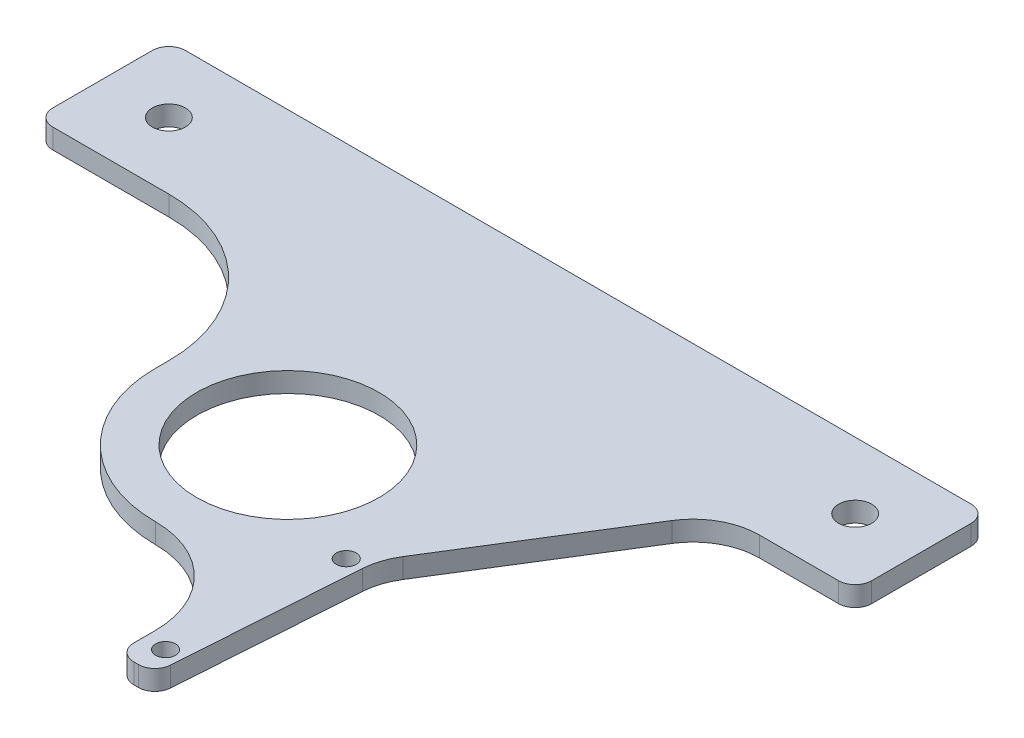
ISO-10303-21;
HEADER;
FILE_DESCRIPTION(('STEP AP214'),'2;1');
FILE_NAME('part.step','',(''),(''),'','','');
FILE_SCHEMA(('AUTOMOTIVE_DESIGN { 1 0 10303 214 1 1 1 1 }'));
ENDSEC;
DATA;
#1=APPLICATION_CONTEXT('core data for automotive mechanical design processes');
#2=APPLICATION_PROTOCOL_DEFINITION('international standard','automotive_design',2000,#1);
#3=PRODUCT_CONTEXT('',#1,'mechanical');
#4=PRODUCT('Part','Part','',(#3));
#5=PRODUCT_RELATED_PRODUCT_CATEGORY('part','',(#4));
#6=PRODUCT_DEFINITION_FORMATION('','',#4);
#7=PRODUCT_DEFINITION_CONTEXT('part definition',#1,'design');
#8=PRODUCT_DEFINITION('design','',#6,#7);
#9=PRODUCT_DEFINITION_SHAPE('','',#8);
#10=(LENGTH_UNIT() NAMED_UNIT(*) SI_UNIT(.MILLI.,.METRE.));
#11=(NAMED_UNIT(*) PLANE_ANGLE_UNIT() SI_UNIT($,.RADIAN.));
#12=(NAMED_UNIT(*) SI_UNIT($,.STERADIAN.) SOLID_ANGLE_UNIT());
#13=UNCERTAINTY_MEASURE_WITH_UNIT(LENGTH_MEASURE(1.E-05),#10,'distance_accuracy_value','');
#14=(GEOMETRIC_REPRESENTATION_CONTEXT(3) GLOBAL_UNCERTAINTY_ASSIGNED_CONTEXT((#13)) GLOBAL_UNIT_ASSIGNED_CONTEXT((#10,
#11,#12)) REPRESENTATION_CONTEXT('',''));
#15=CARTESIAN_POINT('',(0.,0.,0.));
#16=DIRECTION('',(0.,0.,1.));
#17=DIRECTION('',(1.,0.,0.));
#18=AXIS2_PLACEMENT_3D('',#15,#16,#17);
#19=CARTESIAN_POINT('',(-83.5,6.,-4.10000000000002));
#20=DIRECTION('',(0.,1.,0.));
#21=DIRECTION('',(0.,0.,1.));
#22=AXIS2_PLACEMENT_3D('',#19,#20,#21);
#23=PLANE('',#22);
#24=CARTESIAN_POINT('',(-103.5,6.,-67.5999999999998));
#25=DIRECTION('',(0.,1.,0.));
#26=DIRECTION('',(0.,0.,1.));
#27=AXIS2_PLACEMENT_3D('',#24,#25,#26);
#28=CIRCLE('',#27,5.00000000000001);
#29=CARTESIAN_POINT('',(-103.5,6.,-62.5999999999998));
#30=VERTEX_POINT('',#29);
#31=EDGE_CURVE('E437',#30,#30,#28,.T.);
#32=ORIENTED_EDGE('',*,*,#31,.F.);
#33=EDGE_LOOP('',(#32));
#34=FACE_BOUND('',#33,.T.);
#35=CARTESIAN_POINT('',(38.5,6.,20.9));
#36=DIRECTION('',(0.,1.,0.));
#37=DIRECTION('',(0.,0.,1.));
#38=AXIS2_PLACEMENT_3D('',#35,#36,#37);
#39=CIRCLE('',#38,3.);
#40=CARTESIAN_POINT('',(38.5,6.,23.9));
#41=VERTEX_POINT('',#40);
#42=EDGE_CURVE('E421',#41,#41,#39,.T.);
#43=ORIENTED_EDGE('',*,*,#42,.F.);
#44=EDGE_LOOP('',(#43));
#45=FACE_BOUND('',#44,.T.);
#46=DIRECTION('',(1.,0.,0.));
#47=VECTOR('',#46,1.);
#48=CARTESIAN_POINT('',(123.5,6.,-47.6));
#49=LINE('',#48,#47);
#50=CARTESIAN_POINT('',(94.6041078008775,6.,-47.6));
#51=VERTEX_POINT('',#50);
#52=CARTESIAN_POINT('',(118.5,6.,-47.6));
#53=VERTEX_POINT('',#52);
#54=EDGE_CURVE('E251',#51,#53,#49,.T.);
#55=ORIENTED_EDGE('',*,*,#54,.T.);
#56=CARTESIAN_POINT('',(118.5,6.,-52.6));
#57=DIRECTION('',(0.,1.,0.));
#58=DIRECTION('',(0.,0.,1.));
#59=AXIS2_PLACEMENT_3D('',#56,#57,#58);
#60=CIRCLE('',#59,5.);
#61=CARTESIAN_POINT('',(123.5,6.,-52.6));
#62=VERTEX_POINT('',#61);
#63=EDGE_CURVE('E388',#53,#62,#60,.T.);
#64=ORIENTED_EDGE('',*,*,#63,.T.);
#65=DIRECTION('',(0.,0.,-1.));
#66=VECTOR('',#65,1.);
#67=CARTESIAN_POINT('',(123.5,6.,-87.5999999999998));
#68=LINE('',#67,#66);
#69=CARTESIAN_POINT('',(123.5,6.,-82.5999999999998));
#70=VERTEX_POINT('',#69);
#71=EDGE_CURVE('E254',#62,#70,#68,.T.);
#72=ORIENTED_EDGE('',*,*,#71,.T.);
#73=CARTESIAN_POINT('',(118.5,6.,-82.5999999999998));
#74=DIRECTION('',(0.,1.,0.));
#75=DIRECTION('',(0.,0.,1.));
#76=AXIS2_PLACEMENT_3D('',#73,#74,#75);
#77=CIRCLE('',#76,5.);
#78=CARTESIAN_POINT('',(118.5,6.,-87.5999999999998));
#79=VERTEX_POINT('',#78);
#80=EDGE_CURVE('E64',#70,#79,#77,.T.);
#81=ORIENTED_EDGE('',*,*,#80,.T.);
#82=DIRECTION('',(-1.,0.,0.));
#83=VECTOR('',#82,1.);
#84=CARTESIAN_POINT('',(-123.5,6.,-87.5999999999998));
#85=LINE('',#84,#83);
#86=CARTESIAN_POINT('',(-118.5,6.,-87.5999999999998));
#87=VERTEX_POINT('',#86);
#88=EDGE_CURVE('E257',#79,#87,#85,.T.);
#89=ORIENTED_EDGE('',*,*,#88,.T.);
#90=CARTESIAN_POINT('',(-118.5,6.,-82.5999999999998));
#91=DIRECTION('',(0.,1.,0.));
#92=DIRECTION('',(0.,0.,1.));
#93=AXIS2_PLACEMENT_3D('',#90,#91,#92);
#94=CIRCLE('',#93,5.);
#95=CARTESIAN_POINT('',(-123.5,6.,-82.5999999999998));
#96=VERTEX_POINT('',#95);
#97=EDGE_CURVE('E383',#87,#96,#94,.T.);
#98=ORIENTED_EDGE('',*,*,#97,.T.);
#99=DIRECTION('',(0.,0.,1.));
#100=VECTOR('',#99,1.);
#101=CARTESIAN_POINT('',(-123.5,6.,-87.5999999999998));
#102=LINE('',#101,#100);
#103=CARTESIAN_POINT('',(-123.5,6.,-52.5999999999998));
#104=VERTEX_POINT('',#103);
#105=EDGE_CURVE('E198',#96,#104,#102,.T.);
#106=ORIENTED_EDGE('',*,*,#105,.T.);
#107=CARTESIAN_POINT('',(-118.5,6.,-52.5999999999998));
#108=DIRECTION('',(0.,1.,0.));
#109=DIRECTION('',(0.,0.,1.));
#110=AXIS2_PLACEMENT_3D('',#107,#108,#109);
#111=CIRCLE('',#110,5.);
#112=CARTESIAN_POINT('',(-118.5,6.,-47.5999999999999));
#113=VERTEX_POINT('',#112);
#114=EDGE_CURVE('E194',#104,#113,#111,.T.);
#115=ORIENTED_EDGE('',*,*,#114,.T.);
#116=DIRECTION('',(1.,0.,0.));
#117=VECTOR('',#116,1.);
#118=CARTESIAN_POINT('',(-83.5,6.,-47.6));
#119=LINE('',#118,#117);
#120=CARTESIAN_POINT('',(-83.5,6.,-47.6));
#121=VERTEX_POINT('',#120);
#122=EDGE_CURVE('E185',#113,#121,#119,.T.);
#123=ORIENTED_EDGE('',*,*,#122,.T.);
#124=CARTESIAN_POINT('',(-83.5,6.,-4.10000000000002));
#125=DIRECTION('',(0.,-1.,0.));
#126=DIRECTION('',(0.,0.,1.));
#127=AXIS2_PLACEMENT_3D('',#124,#125,#126);
#128=CIRCLE('',#127,43.5);
#129=CARTESIAN_POINT('',(-40.,6.,-4.10000000000002));
#130=VERTEX_POINT('',#129);
#131=EDGE_CURVE('E190',#121,#130,#128,.T.);
#132=ORIENTED_EDGE('',*,*,#131,.T.);
#133=DIRECTION('',(0.,0.,1.));
#134=VECTOR('',#133,1.);
#135=CARTESIAN_POINT('',(-40.,6.,0.));
#136=LINE('',#135,#134);
#137=CARTESIAN_POINT('',(-40.,6.,0.));
#138=VERTEX_POINT('',#137);
#139=EDGE_CURVE('E215',#130,#138,#136,.T.);
#140=ORIENTED_EDGE('',*,*,#139,.T.);
#141=CARTESIAN_POINT('',(0.,6.,0.));
#142=DIRECTION('',(0.,1.,0.));
#143=DIRECTION('',(0.,0.,1.));
#144=AXIS2_PLACEMENT_3D('',#141,#142,#143);
#145=CIRCLE('',#144,40.);
#146=CARTESIAN_POINT('',(0.,6.,40.));
#147=VERTEX_POINT('',#146);
#148=EDGE_CURVE('E218',#138,#147,#145,.T.);
#149=ORIENTED_EDGE('',*,*,#148,.T.);
#150=CARTESIAN_POINT('',(0.,6.,68.4627408788224));
#151=DIRECTION('',(0.,-1.,0.));
#152=DIRECTION('',(0.,0.,-1.));
#153=AXIS2_PLACEMENT_3D('',#150,#151,#152);
#154=CIRCLE('',#153,28.4627408788224);
#155=CARTESIAN_POINT('',(28.4627408788224,6.,68.4627408788224));
#156=VERTEX_POINT('',#155);
#157=EDGE_CURVE('E224',#147,#156,#154,.T.);
#158=ORIENTED_EDGE('',*,*,#157,.T.);
#159=DIRECTION('',(0.,0.,1.));
#160=VECTOR('',#159,1.);
#161=CARTESIAN_POINT('',(28.4627408788224,6.,74.8999999999999));
#162=LINE('',#161,#160);
#163=CARTESIAN_POINT('',(28.4627408788224,6.,74.8999999999999));
#164=VERTEX_POINT('',#163);
#165=EDGE_CURVE('E227',#156,#164,#162,.T.);
#166=ORIENTED_EDGE('',*,*,#165,.T.);
#167=CARTESIAN_POINT('',(33.4627408788224,6.,74.8999999999999));
#168=DIRECTION('',(0.,1.,0.));
#169=DIRECTION('',(0.,0.,-1.));
#170=AXIS2_PLACEMENT_3D('',#167,#168,#169);
#171=CIRCLE('',#170,5.);
#172=CARTESIAN_POINT('',(33.4627408788224,6.,79.8999999999999));
#173=VERTEX_POINT('',#172);
#174=EDGE_CURVE('E230',#164,#173,#171,.T.);
#175=ORIENTED_EDGE('',*,*,#174,.T.);
#176=DIRECTION('',(1.,0.,0.));
#177=VECTOR('',#176,1.);
#178=CARTESIAN_POINT('',(34.7941176470588,6.,79.8999999999999));
#179=LINE('',#178,#177);
#180=CARTESIAN_POINT('',(34.7941176470588,6.,79.8999999999999));
#181=VERTEX_POINT('',#180);
#182=EDGE_CURVE('E233',#173,#181,#179,.T.);
#183=ORIENTED_EDGE('',*,*,#182,.T.);
#184=CARTESIAN_POINT('',(34.7941176470588,6.,74.8999999999999));
#185=DIRECTION('',(0.,1.,0.));
#186=DIRECTION('',(0.,0.,1.));
#187=AXIS2_PLACEMENT_3D('',#184,#185,#186);
#188=CIRCLE('',#187,5.);
#189=CARTESIAN_POINT('',(39.7823847572921,6.,75.2423320565846));
#190=VERTEX_POINT('',#189);
#191=EDGE_CURVE('E236',#181,#190,#188,.T.);
#192=ORIENTED_EDGE('',*,*,#191,.T.);
#193=DIRECTION('',(0.0684664113169268,0.,-0.997653422046645));
#194=VECTOR('',#193,1.);
#195=CARTESIAN_POINT('',(39.7823847572921,6.,75.2423320565846));
#196=LINE('',#195,#194);
#197=CARTESIAN_POINT('',(43.502792815924,6.,21.0306717736615));
#198=VERTEX_POINT('',#197);
#199=EDGE_CURVE('E239',#190,#198,#196,.T.);
#200=ORIENTED_EDGE('',*,*,#199,.T.);
#201=CARTESIAN_POINT('',(63.455861256857,6.,22.4));
#202=DIRECTION('',(0.,-1.,0.));
#203=DIRECTION('',(0.,0.,-1.));
#204=AXIS2_PLACEMENT_3D('',#201,#202,#203);
#205=CIRCLE('',#204,20.);
#206=CARTESIAN_POINT('',(46.4803869601442,6.,11.8248748280861));
#207=VERTEX_POINT('',#206);
#208=EDGE_CURVE('E242',#198,#207,#205,.T.);
#209=ORIENTED_EDGE('',*,*,#208,.T.);
#210=DIRECTION('',(0.528756258595692,0.,-0.848773714835636));
#211=VECTOR('',#210,1.);
#212=CARTESIAN_POINT('',(77.6286335041648,6.,-38.1751251719139));
#213=LINE('',#212,#211);
#214=CARTESIAN_POINT('',(77.6286335041648,6.,-38.1751251719139));
#215=VERTEX_POINT('',#214);
#216=EDGE_CURVE('E245',#207,#215,#213,.T.);
#217=ORIENTED_EDGE('',*,*,#216,.T.);
#218=CARTESIAN_POINT('',(94.6041078008775,6.,-27.6));
#219=DIRECTION('',(0.,-1.,0.));
#220=DIRECTION('',(0.,0.,1.));
#221=AXIS2_PLACEMENT_3D('',#218,#219,#220);
#222=CIRCLE('',#221,20.);
#223=EDGE_CURVE('E248',#215,#51,#222,.T.);
#224=ORIENTED_EDGE('',*,*,#223,.T.);
#225=EDGE_LOOP('',(#55,#64,#72,#81,#89,#98,#106,#115,#123,#132,#140,#149,#158,#166,#175,#183,
#192,#200,#209,#217,#224));
#226=FACE_BOUND('',#225,.T.);
#227=CARTESIAN_POINT('',(0.,6.,0.));
#228=DIRECTION('',(0.,1.,0.));
#229=DIRECTION('',(0.,0.,1.));
#230=AXIS2_PLACEMENT_3D('',#227,#228,#229);
#231=CIRCLE('',#230,27.5);
#232=CARTESIAN_POINT('',(0.,6.,27.5));
#233=VERTEX_POINT('',#232);
#234=EDGE_CURVE('E265',#233,#233,#231,.T.);
#235=ORIENTED_EDGE('',*,*,#234,.F.);
#236=EDGE_LOOP('',(#235));
#237=FACE_BOUND('',#236,.T.);
#238=CARTESIAN_POINT('',(35.,6.,71.9));
#239=DIRECTION('',(0.,1.,0.));
#240=DIRECTION('',(0.,0.,1.));
#241=AXIS2_PLACEMENT_3D('',#238,#239,#240);
#242=CIRCLE('',#241,3.);
#243=CARTESIAN_POINT('',(35.,6.,74.9));
#244=VERTEX_POINT('',#243);
#245=EDGE_CURVE('E429',#244,#244,#242,.T.);
#246=ORIENTED_EDGE('',*,*,#245,.F.);
#247=EDGE_LOOP('',(#246));
#248=FACE_BOUND('',#247,.T.);
#249=CARTESIAN_POINT('',(103.5,6.,-67.5999999999998));
#250=DIRECTION('',(0.,1.,0.));
#251=DIRECTION('',(0.,0.,-1.));
#252=AXIS2_PLACEMENT_3D('',#249,#250,#251);
#253=CIRCLE('',#252,5.00000000000001);
#254=CARTESIAN_POINT('',(103.5,6.,-72.5999999999998));
#255=VERTEX_POINT('',#254);
#256=EDGE_CURVE('E445',#255,#255,#253,.T.);
#257=ORIENTED_EDGE('',*,*,#256,.F.);
#258=EDGE_LOOP('',(#257));
#259=FACE_BOUND('',#258,.T.);
#260=ADVANCED_FACE('F41',(#34,#45,#226,#237,#248,#259),#23,.T.);
#261=CARTESIAN_POINT('',(-83.5,0.,-4.10000000000002));
#262=DIRECTION('',(0.,1.,0.));
#263=DIRECTION('',(0.,0.,1.));
#264=AXIS2_PLACEMENT_3D('',#261,#262,#263);
#265=PLANE('',#264);
#266=DIRECTION('',(0.,0.,-1.));
#267=VECTOR('',#266,1.);
#268=CARTESIAN_POINT('',(123.5,0.,-87.5999999999998));
#269=LINE('',#268,#267);
#270=CARTESIAN_POINT('',(123.5,0.,-52.6));
#271=VERTEX_POINT('',#270);
#272=CARTESIAN_POINT('',(123.5,0.,-82.5999999999998));
#273=VERTEX_POINT('',#272);
#274=EDGE_CURVE('E308',#271,#273,#269,.T.);
#275=ORIENTED_EDGE('',*,*,#274,.F.);
#276=CARTESIAN_POINT('',(118.5,0.,-52.6));
#277=DIRECTION('',(0.,1.,0.));
#278=DIRECTION('',(0.,0.,1.));
#279=AXIS2_PLACEMENT_3D('',#276,#277,#278);
#280=CIRCLE('',#279,5.);
#281=CARTESIAN_POINT('',(118.5,0.,-47.6));
#282=VERTEX_POINT('',#281);
#283=EDGE_CURVE('E375',#271,#282,#280,.F.);
#284=ORIENTED_EDGE('',*,*,#283,.T.);
#285=DIRECTION('',(1.,0.,0.));
#286=VECTOR('',#285,1.);
#287=CARTESIAN_POINT('',(123.5,0.,-47.6));
#288=LINE('',#287,#286);
#289=CARTESIAN_POINT('',(94.6041078008775,0.,-47.6));
#290=VERTEX_POINT('',#289);
#291=EDGE_CURVE('E304',#290,#282,#288,.T.);
#292=ORIENTED_EDGE('',*,*,#291,.F.);
#293=CARTESIAN_POINT('',(94.6041078008775,0.,-27.6));
#294=DIRECTION('',(0.,-1.,0.));
#295=DIRECTION('',(0.,0.,1.));
#296=AXIS2_PLACEMENT_3D('',#293,#294,#295);
#297=CIRCLE('',#296,20.);
#298=CARTESIAN_POINT('',(77.6286335041648,0.,-38.1751251719139));
#299=VERTEX_POINT('',#298);
#300=EDGE_CURVE('E301',#299,#290,#297,.T.);
#301=ORIENTED_EDGE('',*,*,#300,.F.);
#302=DIRECTION('',(0.528756258595692,0.,-0.848773714835636));
#303=VECTOR('',#302,1.);
#304=CARTESIAN_POINT('',(77.6286335041648,0.,-38.1751251719139));
#305=LINE('',#304,#303);
#306=CARTESIAN_POINT('',(46.4803869601442,0.,11.8248748280861));
#307=VERTEX_POINT('',#306);
#308=EDGE_CURVE('E298',#307,#299,#305,.T.);
#309=ORIENTED_EDGE('',*,*,#308,.F.);
#310=CARTESIAN_POINT('',(63.455861256857,0.,22.4));
#311=DIRECTION('',(0.,-1.,0.));
#312=DIRECTION('',(0.,0.,-1.));
#313=AXIS2_PLACEMENT_3D('',#310,#311,#312);
#314=CIRCLE('',#313,20.);
#315=CARTESIAN_POINT('',(43.502792815924,0.,21.0306717736615));
#316=VERTEX_POINT('',#315);
#317=EDGE_CURVE('E295',#316,#307,#314,.T.);
#318=ORIENTED_EDGE('',*,*,#317,.F.);
#319=DIRECTION('',(0.0684664113169268,0.,-0.997653422046645));
#320=VECTOR('',#319,1.);
#321=CARTESIAN_POINT('',(39.7823847572921,0.,75.2423320565846));
#322=LINE('',#321,#320);
#323=CARTESIAN_POINT('',(39.7823847572921,0.,75.2423320565846));
#324=VERTEX_POINT('',#323);
#325=EDGE_CURVE('E292',#324,#316,#322,.T.);
#326=ORIENTED_EDGE('',*,*,#325,.F.);
#327=CARTESIAN_POINT('',(34.7941176470588,0.,74.8999999999999));
#328=DIRECTION('',(0.,1.,0.));
#329=DIRECTION('',(0.,0.,1.));
#330=AXIS2_PLACEMENT_3D('',#327,#328,#329);
#331=CIRCLE('',#330,5.);
#332=CARTESIAN_POINT('',(34.7941176470588,0.,79.8999999999999));
#333=VERTEX_POINT('',#332);
#334=EDGE_CURVE('E289',#333,#324,#331,.T.);
#335=ORIENTED_EDGE('',*,*,#334,.F.);
#336=DIRECTION('',(1.,0.,0.));
#337=VECTOR('',#336,1.);
#338=CARTESIAN_POINT('',(34.7941176470588,0.,79.8999999999999));
#339=LINE('',#338,#337);
#340=CARTESIAN_POINT('',(33.4627408788224,0.,79.8999999999999));
#341=VERTEX_POINT('',#340);
#342=EDGE_CURVE('E286',#341,#333,#339,.T.);
#343=ORIENTED_EDGE('',*,*,#342,.F.);
#344=CARTESIAN_POINT('',(33.4627408788224,0.,74.8999999999999));
#345=DIRECTION('',(0.,1.,0.));
#346=DIRECTION('',(0.,0.,-1.));
#347=AXIS2_PLACEMENT_3D('',#344,#345,#346);
#348=CIRCLE('',#347,5.);
#349=CARTESIAN_POINT('',(28.4627408788224,0.,74.8999999999999));
#350=VERTEX_POINT('',#349);
#351=EDGE_CURVE('E283',#350,#341,#348,.T.);
#352=ORIENTED_EDGE('',*,*,#351,.F.);
#353=DIRECTION('',(0.,0.,1.));
#354=VECTOR('',#353,1.);
#355=CARTESIAN_POINT('',(28.4627408788224,0.,74.8999999999999));
#356=LINE('',#355,#354);
#357=CARTESIAN_POINT('',(28.4627408788224,0.,68.4627408788224));
#358=VERTEX_POINT('',#357);
#359=EDGE_CURVE('E280',#358,#350,#356,.T.);
#360=ORIENTED_EDGE('',*,*,#359,.F.);
#361=CARTESIAN_POINT('',(0.,0.,68.4627408788224));
#362=DIRECTION('',(0.,-1.,0.));
#363=DIRECTION('',(0.,0.,-1.));
#364=AXIS2_PLACEMENT_3D('',#361,#362,#363);
#365=CIRCLE('',#364,28.4627408788224);
#366=CARTESIAN_POINT('',(0.,0.,40.));
#367=VERTEX_POINT('',#366);
#368=EDGE_CURVE('E277',#367,#358,#365,.T.);
#369=ORIENTED_EDGE('',*,*,#368,.F.);
#370=CARTESIAN_POINT('',(0.,0.,0.));
#371=DIRECTION('',(0.,1.,0.));
#372=DIRECTION('',(0.,0.,1.));
#373=AXIS2_PLACEMENT_3D('',#370,#371,#372);
#374=CIRCLE('',#373,40.);
#375=CARTESIAN_POINT('',(-40.,0.,0.));
#376=VERTEX_POINT('',#375);
#377=EDGE_CURVE('E274',#376,#367,#374,.T.);
#378=ORIENTED_EDGE('',*,*,#377,.F.);
#379=DIRECTION('',(0.,0.,1.));
#380=VECTOR('',#379,1.);
#381=CARTESIAN_POINT('',(-40.,0.,0.));
#382=LINE('',#381,#380);
#383=CARTESIAN_POINT('',(-40.,0.,-4.10000000000002));
#384=VERTEX_POINT('',#383);
#385=EDGE_CURVE('E271',#384,#376,#382,.T.);
#386=ORIENTED_EDGE('',*,*,#385,.F.);
#387=CARTESIAN_POINT('',(-83.5,0.,-4.10000000000002));
#388=DIRECTION('',(0.,-1.,0.));
#389=DIRECTION('',(0.,0.,1.));
#390=AXIS2_PLACEMENT_3D('',#387,#388,#389);
#391=CIRCLE('',#390,43.5);
#392=CARTESIAN_POINT('',(-83.5,0.,-47.6));
#393=VERTEX_POINT('',#392);
#394=EDGE_CURVE('E268',#393,#384,#391,.T.);
#395=ORIENTED_EDGE('',*,*,#394,.F.);
#396=DIRECTION('',(1.,0.,0.));
#397=VECTOR('',#396,1.);
#398=CARTESIAN_POINT('',(-83.5,0.,-47.6));
#399=LINE('',#398,#397);
#400=CARTESIAN_POINT('',(-118.5,0.,-47.5999999999999));
#401=VERTEX_POINT('',#400);
#402=EDGE_CURVE('E204',#401,#393,#399,.T.);
#403=ORIENTED_EDGE('',*,*,#402,.F.);
#404=CARTESIAN_POINT('',(-118.5,0.,-52.5999999999998));
#405=DIRECTION('',(0.,1.,0.));
#406=DIRECTION('',(0.,0.,1.));
#407=AXIS2_PLACEMENT_3D('',#404,#405,#406);
#408=CIRCLE('',#407,5.);
#409=CARTESIAN_POINT('',(-123.5,0.,-52.5999999999998));
#410=VERTEX_POINT('',#409);
#411=EDGE_CURVE('E366',#401,#410,#408,.F.);
#412=ORIENTED_EDGE('',*,*,#411,.T.);
#413=DIRECTION('',(0.,0.,1.));
#414=VECTOR('',#413,1.);
#415=CARTESIAN_POINT('',(-123.5,0.,-87.5999999999998));
#416=LINE('',#415,#414);
#417=CARTESIAN_POINT('',(-123.5,0.,-82.5999999999998));
#418=VERTEX_POINT('',#417);
#419=EDGE_CURVE('E261',#418,#410,#416,.T.);
#420=ORIENTED_EDGE('',*,*,#419,.F.);
#421=CARTESIAN_POINT('',(-118.5,0.,-82.5999999999998));
#422=DIRECTION('',(0.,1.,0.));
#423=DIRECTION('',(0.,0.,1.));
#424=AXIS2_PLACEMENT_3D('',#421,#422,#423);
#425=CIRCLE('',#424,5.);
#426=CARTESIAN_POINT('',(-118.5,0.,-87.5999999999998));
#427=VERTEX_POINT('',#426);
#428=EDGE_CURVE('E369',#418,#427,#425,.F.);
#429=ORIENTED_EDGE('',*,*,#428,.T.);
#430=DIRECTION('',(-1.,0.,0.));
#431=VECTOR('',#430,1.);
#432=CARTESIAN_POINT('',(-123.5,0.,-87.5999999999998));
#433=LINE('',#432,#431);
#434=CARTESIAN_POINT('',(118.5,0.,-87.5999999999998));
#435=VERTEX_POINT('',#434);
#436=EDGE_CURVE('E312',#435,#427,#433,.T.);
#437=ORIENTED_EDGE('',*,*,#436,.F.);
#438=CARTESIAN_POINT('',(118.5,0.,-82.5999999999998));
#439=DIRECTION('',(0.,1.,0.));
#440=DIRECTION('',(0.,0.,1.));
#441=AXIS2_PLACEMENT_3D('',#438,#439,#440);
#442=CIRCLE('',#441,5.);
#443=EDGE_CURVE('E372',#435,#273,#442,.F.);
#444=ORIENTED_EDGE('',*,*,#443,.T.);
#445=EDGE_LOOP('',(#275,#284,#292,#301,#309,#318,#326,#335,#343,#352,#360,#369,#378,#386,#395,
#403,#412,#420,#429,#437,#444));
#446=FACE_BOUND('',#445,.T.);
#447=CARTESIAN_POINT('',(0.,0.,0.));
#448=DIRECTION('',(0.,1.,0.));
#449=DIRECTION('',(0.,0.,1.));
#450=AXIS2_PLACEMENT_3D('',#447,#448,#449);
#451=CIRCLE('',#450,27.5);
#452=CARTESIAN_POINT('',(0.,0.,27.5));
#453=VERTEX_POINT('',#452);
#454=EDGE_CURVE('E417',#453,#453,#451,.T.);
#455=ORIENTED_EDGE('',*,*,#454,.T.);
#456=EDGE_LOOP('',(#455));
#457=FACE_BOUND('',#456,.T.);
#458=CARTESIAN_POINT('',(38.5,0.,20.9));
#459=DIRECTION('',(0.,1.,0.));
#460=DIRECTION('',(0.,0.,1.));
#461=AXIS2_PLACEMENT_3D('',#458,#459,#460);
#462=CIRCLE('',#461,3.);
#463=CARTESIAN_POINT('',(38.5,0.,23.9));
#464=VERTEX_POINT('',#463);
#465=EDGE_CURVE('E425',#464,#464,#462,.T.);
#466=ORIENTED_EDGE('',*,*,#465,.T.);
#467=EDGE_LOOP('',(#466));
#468=FACE_BOUND('',#467,.T.);
#469=CARTESIAN_POINT('',(35.,0.,71.9));
#470=DIRECTION('',(0.,1.,0.));
#471=DIRECTION('',(0.,0.,1.));
#472=AXIS2_PLACEMENT_3D('',#469,#470,#471);
#473=CIRCLE('',#472,3.);
#474=CARTESIAN_POINT('',(35.,0.,74.9));
#475=VERTEX_POINT('',#474);
#476=EDGE_CURVE('E433',#475,#475,#473,.T.);
#477=ORIENTED_EDGE('',*,*,#476,.T.);
#478=EDGE_LOOP('',(#477));
#479=FACE_BOUND('',#478,.T.);
#480=CARTESIAN_POINT('',(-103.5,0.,-67.5999999999998));
#481=DIRECTION('',(0.,1.,0.));
#482=DIRECTION('',(0.,0.,1.));
#483=AXIS2_PLACEMENT_3D('',#480,#481,#482);
#484=CIRCLE('',#483,5.00000000000001);
#485=CARTESIAN_POINT('',(-103.5,0.,-62.5999999999998));
#486=VERTEX_POINT('',#485);
#487=EDGE_CURVE('E441',#486,#486,#484,.T.);
#488=ORIENTED_EDGE('',*,*,#487,.T.);
#489=EDGE_LOOP('',(#488));
#490=FACE_BOUND('',#489,.T.);
#491=CARTESIAN_POINT('',(103.5,0.,-67.5999999999998));
#492=DIRECTION('',(0.,1.,0.));
#493=DIRECTION('',(0.,0.,-1.));
#494=AXIS2_PLACEMENT_3D('',#491,#492,#493);
#495=CIRCLE('',#494,5.00000000000001);
#496=CARTESIAN_POINT('',(103.5,0.,-72.5999999999998));
#497=VERTEX_POINT('',#496);
#498=EDGE_CURVE('E449',#497,#497,#495,.T.);
#499=ORIENTED_EDGE('',*,*,#498,.T.);
#500=EDGE_LOOP('',(#499));
#501=FACE_BOUND('',#500,.T.);
#502=ADVANCED_FACE('F411',(#446,#457,#468,#479,#490,#501),#265,.F.);
#503=CARTESIAN_POINT('',(-123.5,6.,-87.5999999999998));
#504=DIRECTION('',(1.,0.,0.));
#505=DIRECTION('',(0.,0.,-1.));
#506=AXIS2_PLACEMENT_3D('',#503,#504,#505);
#507=PLANE('',#506);
#508=ORIENTED_EDGE('',*,*,#105,.F.);
#509=DIRECTION('',(0.,-1.,0.));
#510=VECTOR('',#509,1.);
#511=CARTESIAN_POINT('',(-123.5,6.,-82.5999999999998));
#512=LINE('',#511,#510);
#513=EDGE_CURVE('E50',#96,#418,#512,.T.);
#514=ORIENTED_EDGE('',*,*,#513,.T.);
#515=ORIENTED_EDGE('',*,*,#419,.T.);
#516=DIRECTION('',(0.,-1.,0.));
#517=VECTOR('',#516,1.);
#518=CARTESIAN_POINT('',(-123.5,6.,-52.5999999999998));
#519=LINE('',#518,#517);
#520=EDGE_CURVE('E397',#410,#104,#519,.F.);
#521=ORIENTED_EDGE('',*,*,#520,.T.);
#522=EDGE_LOOP('',(#508,#514,#515,#521));
#523=FACE_BOUND('',#522,.T.);
#524=ADVANCED_FACE('F405',(#523),#507,.F.);
#525=CARTESIAN_POINT('',(-83.5,6.,-47.6));
#526=DIRECTION('',(0.,0.,-1.));
#527=DIRECTION('',(-1.,0.,0.));
#528=AXIS2_PLACEMENT_3D('',#525,#526,#527);
#529=PLANE('',#528);
#530=ORIENTED_EDGE('',*,*,#122,.F.);
#531=DIRECTION('',(0.,-1.,0.));
#532=VECTOR('',#531,1.);
#533=CARTESIAN_POINT('',(-118.5,6.,-47.5999999999999));
#534=LINE('',#533,#532);
#535=EDGE_CURVE('E11',#113,#401,#534,.T.);
#536=ORIENTED_EDGE('',*,*,#535,.T.);
#537=ORIENTED_EDGE('',*,*,#402,.T.);
#538=DIRECTION('',(0.,-1.,0.));
#539=VECTOR('',#538,1.);
#540=CARTESIAN_POINT('',(-83.5,6.,-47.6));
#541=LINE('',#540,#539);
#542=EDGE_CURVE('E201',#121,#393,#541,.T.);
#543=ORIENTED_EDGE('',*,*,#542,.F.);
#544=EDGE_LOOP('',(#530,#536,#537,#543));
#545=FACE_BOUND('',#544,.T.);
#546=ADVANCED_FACE('F202',(#545),#529,.F.);
#547=CARTESIAN_POINT('',(-83.5,6.,-4.10000000000002));
#548=DIRECTION('',(0.,-1.,0.));
#549=DIRECTION('',(0.,0.,-1.));
#550=AXIS2_PLACEMENT_3D('',#547,#548,#549);
#551=CYLINDRICAL_SURFACE('',#550,43.5);
#552=ORIENTED_EDGE('',*,*,#394,.T.);
#553=DIRECTION('',(0.,-1.,0.));
#554=VECTOR('',#553,1.);
#555=CARTESIAN_POINT('',(-40.,6.,-4.10000000000002));
#556=LINE('',#555,#554);
#557=EDGE_CURVE('E209',#130,#384,#556,.T.);
#558=ORIENTED_EDGE('',*,*,#557,.F.);
#559=ORIENTED_EDGE('',*,*,#131,.F.);
#560=ORIENTED_EDGE('',*,*,#542,.T.);
#561=EDGE_LOOP('',(#552,#558,#559,#560));
#562=FACE_BOUND('',#561,.T.);
#563=ADVANCED_FACE('F211',(#562),#551,.F.);
#564=CARTESIAN_POINT('',(-40.,6.,0.));
#565=DIRECTION('',(1.,0.,0.));
#566=DIRECTION('',(0.,0.,-1.));
#567=AXIS2_PLACEMENT_3D('',#564,#565,#566);
#568=PLANE('',#567);
#569=ORIENTED_EDGE('',*,*,#385,.T.);
#570=DIRECTION('',(0.,-1.,0.));
#571=VECTOR('',#570,1.);
#572=CARTESIAN_POINT('',(-40.,6.,0.));
#573=LINE('',#572,#571);
#574=EDGE_CURVE('E354',#138,#376,#573,.T.);
#575=ORIENTED_EDGE('',*,*,#574,.F.);
#576=ORIENTED_EDGE('',*,*,#139,.F.);
#577=ORIENTED_EDGE('',*,*,#557,.T.);
#578=EDGE_LOOP('',(#569,#575,#576,#577));
#579=FACE_BOUND('',#578,.T.);
#580=ADVANCED_FACE('F523',(#579),#568,.F.);
#581=CARTESIAN_POINT('',(0.,6.,0.));
#582=DIRECTION('',(0.,-1.,0.));
#583=DIRECTION('',(0.,0.,-1.));
#584=AXIS2_PLACEMENT_3D('',#581,#582,#583);
#585=CYLINDRICAL_SURFACE('',#584,40.);
#586=ORIENTED_EDGE('',*,*,#377,.T.);
#587=DIRECTION('',(0.,-1.,0.));
#588=VECTOR('',#587,1.);
#589=CARTESIAN_POINT('',(0.,6.,40.));
#590=LINE('',#589,#588);
#591=EDGE_CURVE('E350',#147,#367,#590,.T.);
#592=ORIENTED_EDGE('',*,*,#591,.F.);
#593=ORIENTED_EDGE('',*,*,#148,.F.);
#594=ORIENTED_EDGE('',*,*,#574,.T.);
#595=EDGE_LOOP('',(#586,#592,#593,#594));
#596=FACE_BOUND('',#595,.T.);
#597=ADVANCED_FACE('F519',(#596),#585,.T.);
#598=CARTESIAN_POINT('',(0.,6.,68.4627408788224));
#599=DIRECTION('',(0.,-1.,0.));
#600=DIRECTION('',(0.,0.,-1.));
#601=AXIS2_PLACEMENT_3D('',#598,#599,#600);
#602=CYLINDRICAL_SURFACE('',#601,28.4627408788224);
#603=ORIENTED_EDGE('',*,*,#368,.T.);
#604=DIRECTION('',(0.,-1.,0.));
#605=VECTOR('',#604,1.);
#606=CARTESIAN_POINT('',(28.4627408788224,6.,68.4627408788224));
#607=LINE('',#606,#605);
#608=EDGE_CURVE('E346',#156,#358,#607,.T.);
#609=ORIENTED_EDGE('',*,*,#608,.F.);
#610=ORIENTED_EDGE('',*,*,#157,.F.);
#611=ORIENTED_EDGE('',*,*,#591,.T.);
#612=EDGE_LOOP('',(#603,#609,#610,#611));
#613=FACE_BOUND('',#612,.T.);
#614=ADVANCED_FACE('F515',(#613),#602,.F.);
#615=CARTESIAN_POINT('',(28.4627408788224,6.,74.8999999999999));
#616=DIRECTION('',(1.,0.,0.));
#617=DIRECTION('',(0.,0.,-1.));
#618=AXIS2_PLACEMENT_3D('',#615,#616,#617);
#619=PLANE('',#618);
#620=ORIENTED_EDGE('',*,*,#359,.T.);
#621=DIRECTION('',(0.,-1.,0.));
#622=VECTOR('',#621,1.);
#623=CARTESIAN_POINT('',(28.4627408788224,6.,74.8999999999999));
#624=LINE('',#623,#622);
#625=EDGE_CURVE('E342',#164,#350,#624,.T.);
#626=ORIENTED_EDGE('',*,*,#625,.F.);
#627=ORIENTED_EDGE('',*,*,#165,.F.);
#628=ORIENTED_EDGE('',*,*,#608,.T.);
#629=EDGE_LOOP('',(#620,#626,#627,#628));
#630=FACE_BOUND('',#629,.T.);
#631=ADVANCED_FACE('F511',(#630),#619,.F.);
#632=CARTESIAN_POINT('',(33.4627408788224,6.,74.8999999999999));
#633=DIRECTION('',(0.,-1.,0.));
#634=DIRECTION('',(0.,0.,-1.));
#635=AXIS2_PLACEMENT_3D('',#632,#633,#634);
#636=CYLINDRICAL_SURFACE('',#635,5.);
#637=ORIENTED_EDGE('',*,*,#351,.T.);
#638=DIRECTION('',(0.,-1.,0.));
#639=VECTOR('',#638,1.);
#640=CARTESIAN_POINT('',(33.4627408788224,6.,79.8999999999999));
#641=LINE('',#640,#639);
#642=EDGE_CURVE('E338',#173,#341,#641,.T.);
#643=ORIENTED_EDGE('',*,*,#642,.F.);
#644=ORIENTED_EDGE('',*,*,#174,.F.);
#645=ORIENTED_EDGE('',*,*,#625,.T.);
#646=EDGE_LOOP('',(#637,#643,#644,#645));
#647=FACE_BOUND('',#646,.T.);
#648=ADVANCED_FACE('F507',(#647),#636,.T.);
#649=CARTESIAN_POINT('',(34.7941176470588,6.,79.8999999999999));
#650=DIRECTION('',(0.,0.,-1.));
#651=DIRECTION('',(-1.,0.,0.));
#652=AXIS2_PLACEMENT_3D('',#649,#650,#651);
#653=PLANE('',#652);
#654=ORIENTED_EDGE('',*,*,#342,.T.);
#655=DIRECTION('',(0.,-1.,0.));
#656=VECTOR('',#655,1.);
#657=CARTESIAN_POINT('',(34.7941176470588,6.,79.8999999999999));
#658=LINE('',#657,#656);
#659=EDGE_CURVE('E334',#181,#333,#658,.T.);
#660=ORIENTED_EDGE('',*,*,#659,.F.);
#661=ORIENTED_EDGE('',*,*,#182,.F.);
#662=ORIENTED_EDGE('',*,*,#642,.T.);
#663=EDGE_LOOP('',(#654,#660,#661,#662));
#664=FACE_BOUND('',#663,.T.);
#665=ADVANCED_FACE('F503',(#664),#653,.F.);
#666=CARTESIAN_POINT('',(34.7941176470588,6.,74.8999999999999));
#667=DIRECTION('',(0.,-1.,0.));
#668=DIRECTION('',(0.,0.,-1.));
#669=AXIS2_PLACEMENT_3D('',#666,#667,#668);
#670=CYLINDRICAL_SURFACE('',#669,5.);
#671=ORIENTED_EDGE('',*,*,#334,.T.);
#672=DIRECTION('',(0.,-1.,0.));
#673=VECTOR('',#672,1.);
#674=CARTESIAN_POINT('',(39.7823847572921,6.,75.2423320565846));
#675=LINE('',#674,#673);
#676=EDGE_CURVE('E330',#190,#324,#675,.T.);
#677=ORIENTED_EDGE('',*,*,#676,.F.);
#678=ORIENTED_EDGE('',*,*,#191,.F.);
#679=ORIENTED_EDGE('',*,*,#659,.T.);
#680=EDGE_LOOP('',(#671,#677,#678,#679));
#681=FACE_BOUND('',#680,.T.);
#682=ADVANCED_FACE('F499',(#681),#670,.T.);
#683=CARTESIAN_POINT('',(39.7823847572921,6.,75.2423320565846));
#684=DIRECTION('',(-0.997653422046645,0.,-0.0684664113169268));
#685=DIRECTION('',(-0.0684664113169268,0.,0.997653422046645));
#686=AXIS2_PLACEMENT_3D('',#683,#684,#685);
#687=PLANE('',#686);
#688=ORIENTED_EDGE('',*,*,#325,.T.);
#689=DIRECTION('',(0.,-1.,0.));
#690=VECTOR('',#689,1.);
#691=CARTESIAN_POINT('',(43.502792815924,6.,21.0306717736615));
#692=LINE('',#691,#690);
#693=EDGE_CURVE('E326',#198,#316,#692,.T.);
#694=ORIENTED_EDGE('',*,*,#693,.F.);
#695=ORIENTED_EDGE('',*,*,#199,.F.);
#696=ORIENTED_EDGE('',*,*,#676,.T.);
#697=EDGE_LOOP('',(#688,#694,#695,#696));
#698=FACE_BOUND('',#697,.T.);
#699=ADVANCED_FACE('F495',(#698),#687,.F.);
#700=CARTESIAN_POINT('',(63.455861256857,6.,22.4));
#701=DIRECTION('',(0.,-1.,0.));
#702=DIRECTION('',(0.,0.,-1.));
#703=AXIS2_PLACEMENT_3D('',#700,#701,#702);
#704=CYLINDRICAL_SURFACE('',#703,20.);
#705=ORIENTED_EDGE('',*,*,#317,.T.);
#706=DIRECTION('',(0.,-1.,0.));
#707=VECTOR('',#706,1.);
#708=CARTESIAN_POINT('',(46.4803869601442,6.,11.8248748280861));
#709=LINE('',#708,#707);
#710=EDGE_CURVE('E322',#207,#307,#709,.T.);
#711=ORIENTED_EDGE('',*,*,#710,.F.);
#712=ORIENTED_EDGE('',*,*,#208,.F.);
#713=ORIENTED_EDGE('',*,*,#693,.T.);
#714=EDGE_LOOP('',(#705,#711,#712,#713));
#715=FACE_BOUND('',#714,.T.);
#716=ADVANCED_FACE('F491',(#715),#704,.F.);
#717=CARTESIAN_POINT('',(77.6286335041648,6.,-38.1751251719139));
#718=DIRECTION('',(-0.848773714835636,0.,-0.528756258595692));
#719=DIRECTION('',(-0.528756258595692,0.,0.848773714835636));
#720=AXIS2_PLACEMENT_3D('',#717,#718,#719);
#721=PLANE('',#720);
#722=ORIENTED_EDGE('',*,*,#308,.T.);
#723=DIRECTION('',(0.,-1.,0.));
#724=VECTOR('',#723,1.);
#725=CARTESIAN_POINT('',(77.6286335041648,6.,-38.1751251719139));
#726=LINE('',#725,#724);
#727=EDGE_CURVE('E318',#215,#299,#726,.T.);
#728=ORIENTED_EDGE('',*,*,#727,.F.);
#729=ORIENTED_EDGE('',*,*,#216,.F.);
#730=ORIENTED_EDGE('',*,*,#710,.T.);
#731=EDGE_LOOP('',(#722,#728,#729,#730));
#732=FACE_BOUND('',#731,.T.);
#733=ADVANCED_FACE('F487',(#732),#721,.F.);
#734=CARTESIAN_POINT('',(94.6041078008775,6.,-27.6));
#735=DIRECTION('',(0.,-1.,0.));
#736=DIRECTION('',(0.,0.,-1.));
#737=AXIS2_PLACEMENT_3D('',#734,#735,#736);
#738=CYLINDRICAL_SURFACE('',#737,20.);
#739=ORIENTED_EDGE('',*,*,#300,.T.);
#740=DIRECTION('',(0.,-1.,0.));
#741=VECTOR('',#740,1.);
#742=CARTESIAN_POINT('',(94.6041078008775,6.,-47.6));
#743=LINE('',#742,#741);
#744=EDGE_CURVE('E260',#51,#290,#743,.T.);
#745=ORIENTED_EDGE('',*,*,#744,.F.);
#746=ORIENTED_EDGE('',*,*,#223,.F.);
#747=ORIENTED_EDGE('',*,*,#727,.T.);
#748=EDGE_LOOP('',(#739,#745,#746,#747));
#749=FACE_BOUND('',#748,.T.);
#750=ADVANCED_FACE('F483',(#749),#738,.F.);
#751=CARTESIAN_POINT('',(123.5,6.,-47.6));
#752=DIRECTION('',(0.,0.,-1.));
#753=DIRECTION('',(-1.,0.,0.));
#754=AXIS2_PLACEMENT_3D('',#751,#752,#753);
#755=PLANE('',#754);
#756=ORIENTED_EDGE('',*,*,#291,.T.);
#757=DIRECTION('',(0.,-1.,0.));
#758=VECTOR('',#757,1.);
#759=CARTESIAN_POINT('',(118.5,6.,-47.6));
#760=LINE('',#759,#758);
#761=EDGE_CURVE('E378',#282,#53,#760,.F.);
#762=ORIENTED_EDGE('',*,*,#761,.T.);
#763=ORIENTED_EDGE('',*,*,#54,.F.);
#764=ORIENTED_EDGE('',*,*,#744,.T.);
#765=EDGE_LOOP('',(#756,#762,#763,#764));
#766=FACE_BOUND('',#765,.T.);
#767=ADVANCED_FACE('F479',(#766),#755,.F.);
#768=CARTESIAN_POINT('',(123.5,6.,-87.5999999999998));
#769=DIRECTION('',(-1.,0.,0.));
#770=DIRECTION('',(0.,0.,1.));
#771=AXIS2_PLACEMENT_3D('',#768,#769,#770);
#772=PLANE('',#771);
#773=ORIENTED_EDGE('',*,*,#71,.F.);
#774=DIRECTION('',(0.,-1.,0.));
#775=VECTOR('',#774,1.);
#776=CARTESIAN_POINT('',(123.5,6.,-52.6));
#777=LINE('',#776,#775);
#778=EDGE_CURVE('E362',#62,#271,#777,.T.);
#779=ORIENTED_EDGE('',*,*,#778,.T.);
#780=ORIENTED_EDGE('',*,*,#274,.T.);
#781=DIRECTION('',(0.,-1.,0.));
#782=VECTOR('',#781,1.);
#783=CARTESIAN_POINT('',(123.5,6.,-82.5999999999998));
#784=LINE('',#783,#782);
#785=EDGE_CURVE('E208',#273,#70,#784,.F.);
#786=ORIENTED_EDGE('',*,*,#785,.T.);
#787=EDGE_LOOP('',(#773,#779,#780,#786));
#788=FACE_BOUND('',#787,.T.);
#789=ADVANCED_FACE('F476',(#788),#772,.F.);
#790=CARTESIAN_POINT('',(-123.5,6.,-87.5999999999998));
#791=DIRECTION('',(0.,0.,1.));
#792=DIRECTION('',(1.,0.,0.));
#793=AXIS2_PLACEMENT_3D('',#790,#791,#792);
#794=PLANE('',#793);
#795=ORIENTED_EDGE('',*,*,#88,.F.);
#796=DIRECTION('',(0.,-1.,0.));
#797=VECTOR('',#796,1.);
#798=CARTESIAN_POINT('',(118.5,6.,-87.5999999999998));
#799=LINE('',#798,#797);
#800=EDGE_CURVE('E393',#79,#435,#799,.T.);
#801=ORIENTED_EDGE('',*,*,#800,.T.);
#802=ORIENTED_EDGE('',*,*,#436,.T.);
#803=DIRECTION('',(0.,-1.,0.));
#804=VECTOR('',#803,1.);
#805=CARTESIAN_POINT('',(-118.5,6.,-87.5999999999998));
#806=LINE('',#805,#804);
#807=EDGE_CURVE('E57',#427,#87,#806,.F.);
#808=ORIENTED_EDGE('',*,*,#807,.T.);
#809=EDGE_LOOP('',(#795,#801,#802,#808));
#810=FACE_BOUND('',#809,.T.);
#811=ADVANCED_FACE('F473',(#810),#794,.F.);
#812=CARTESIAN_POINT('',(0.,6.,0.));
#813=DIRECTION('',(0.,-1.,0.));
#814=DIRECTION('',(0.,0.,-1.));
#815=AXIS2_PLACEMENT_3D('',#812,#813,#814);
#816=CYLINDRICAL_SURFACE('',#815,27.5);
#817=ORIENTED_EDGE('',*,*,#234,.T.);
#818=EDGE_LOOP('',(#817));
#819=FACE_BOUND('',#818,.T.);
#820=ORIENTED_EDGE('',*,*,#454,.F.);
#821=EDGE_LOOP('',(#820));
#822=FACE_BOUND('',#821,.T.);
#823=ADVANCED_FACE('F470',(#819,#822),#816,.F.);
#824=CARTESIAN_POINT('',(38.5,6.,20.9));
#825=DIRECTION('',(0.,-1.,0.));
#826=DIRECTION('',(0.,0.,-1.));
#827=AXIS2_PLACEMENT_3D('',#824,#825,#826);
#828=CYLINDRICAL_SURFACE('',#827,3.);
#829=ORIENTED_EDGE('',*,*,#42,.T.);
#830=EDGE_LOOP('',(#829));
#831=FACE_BOUND('',#830,.T.);
#832=ORIENTED_EDGE('',*,*,#465,.F.);
#833=EDGE_LOOP('',(#832));
#834=FACE_BOUND('',#833,.T.);
#835=ADVANCED_FACE('F639',(#831,#834),#828,.F.);
#836=CARTESIAN_POINT('',(35.,6.,71.9));
#837=DIRECTION('',(0.,-1.,0.));
#838=DIRECTION('',(0.,0.,-1.));
#839=AXIS2_PLACEMENT_3D('',#836,#837,#838);
#840=CYLINDRICAL_SURFACE('',#839,3.);
#841=ORIENTED_EDGE('',*,*,#245,.T.);
#842=EDGE_LOOP('',(#841));
#843=FACE_BOUND('',#842,.T.);
#844=ORIENTED_EDGE('',*,*,#476,.F.);
#845=EDGE_LOOP('',(#844));
#846=FACE_BOUND('',#845,.T.);
#847=ADVANCED_FACE('F629',(#843,#846),#840,.F.);
#848=CARTESIAN_POINT('',(-103.5,6.,-67.5999999999998));
#849=DIRECTION('',(0.,-1.,0.));
#850=DIRECTION('',(0.,0.,-1.));
#851=AXIS2_PLACEMENT_3D('',#848,#849,#850);
#852=CYLINDRICAL_SURFACE('',#851,5.00000000000001);
#853=ORIENTED_EDGE('',*,*,#31,.T.);
#854=EDGE_LOOP('',(#853));
#855=FACE_BOUND('',#854,.T.);
#856=ORIENTED_EDGE('',*,*,#487,.F.);
#857=EDGE_LOOP('',(#856));
#858=FACE_BOUND('',#857,.T.);
#859=ADVANCED_FACE('F620',(#855,#858),#852,.F.);
#860=CARTESIAN_POINT('',(103.5,6.,-67.5999999999998));
#861=DIRECTION('',(0.,-1.,0.));
#862=DIRECTION('',(0.,0.,-1.));
#863=AXIS2_PLACEMENT_3D('',#860,#861,#862);
#864=CYLINDRICAL_SURFACE('',#863,5.00000000000001);
#865=ORIENTED_EDGE('',*,*,#256,.T.);
#866=EDGE_LOOP('',(#865));
#867=FACE_BOUND('',#866,.T.);
#868=ORIENTED_EDGE('',*,*,#498,.F.);
#869=EDGE_LOOP('',(#868));
#870=FACE_BOUND('',#869,.T.);
#871=ADVANCED_FACE('F457',(#867,#870),#864,.F.);
#872=CARTESIAN_POINT('',(118.5,6.,-52.6));
#873=DIRECTION('',(0.,-1.,0.));
#874=DIRECTION('',(0.,0.,-1.));
#875=AXIS2_PLACEMENT_3D('',#872,#873,#874);
#876=CYLINDRICAL_SURFACE('',#875,5.);
#877=ORIENTED_EDGE('',*,*,#63,.F.);
#878=ORIENTED_EDGE('',*,*,#761,.F.);
#879=ORIENTED_EDGE('',*,*,#283,.F.);
#880=ORIENTED_EDGE('',*,*,#778,.F.);
#881=EDGE_LOOP('',(#877,#878,#879,#880));
#882=FACE_BOUND('',#881,.T.);
#883=ADVANCED_FACE('F534',(#882),#876,.T.);
#884=CARTESIAN_POINT('',(118.5,6.,-82.5999999999998));
#885=DIRECTION('',(0.,-1.,0.));
#886=DIRECTION('',(0.,0.,-1.));
#887=AXIS2_PLACEMENT_3D('',#884,#885,#886);
#888=CYLINDRICAL_SURFACE('',#887,5.);
#889=ORIENTED_EDGE('',*,*,#80,.F.);
#890=ORIENTED_EDGE('',*,*,#785,.F.);
#891=ORIENTED_EDGE('',*,*,#443,.F.);
#892=ORIENTED_EDGE('',*,*,#800,.F.);
#893=EDGE_LOOP('',(#889,#890,#891,#892));
#894=FACE_BOUND('',#893,.T.);
#895=ADVANCED_FACE('F537',(#894),#888,.T.);
#896=CARTESIAN_POINT('',(-118.5,6.,-82.5999999999998));
#897=DIRECTION('',(0.,-1.,0.));
#898=DIRECTION('',(0.,0.,-1.));
#899=AXIS2_PLACEMENT_3D('',#896,#897,#898);
#900=CYLINDRICAL_SURFACE('',#899,5.);
#901=ORIENTED_EDGE('',*,*,#97,.F.);
#902=ORIENTED_EDGE('',*,*,#807,.F.);
#903=ORIENTED_EDGE('',*,*,#428,.F.);
#904=ORIENTED_EDGE('',*,*,#513,.F.);
#905=EDGE_LOOP('',(#901,#902,#903,#904));
#906=FACE_BOUND('',#905,.T.);
#907=ADVANCED_FACE('F540',(#906),#900,.T.);
#908=CARTESIAN_POINT('',(-118.5,6.,-52.5999999999998));
#909=DIRECTION('',(0.,-1.,0.));
#910=DIRECTION('',(0.,0.,-1.));
#911=AXIS2_PLACEMENT_3D('',#908,#909,#910);
#912=CYLINDRICAL_SURFACE('',#911,5.);
#913=ORIENTED_EDGE('',*,*,#114,.F.);
#914=ORIENTED_EDGE('',*,*,#520,.F.);
#915=ORIENTED_EDGE('',*,*,#411,.F.);
#916=ORIENTED_EDGE('',*,*,#535,.F.);
#917=EDGE_LOOP('',(#913,#914,#915,#916));
#918=FACE_BOUND('',#917,.T.);
#919=ADVANCED_FACE('F43',(#918),#912,.T.);
#920=CLOSED_SHELL('',(#260,#502,#524,#546,#563,#580,#597,#614,#631,#648,#665,#682,#699,#716,
#733,#750,#767,#789,#811,#823,#835,#847,#859,#871,#883,#895,#907,#919));
#921=MANIFOLD_SOLID_BREP('B2',#920);
#922=ADVANCED_BREP_SHAPE_REPRESENTATION('',(#18,#921),#14);
#923=SHAPE_DEFINITION_REPRESENTATION(#9,#922);
ENDSEC;
END-ISO-10303-21;
